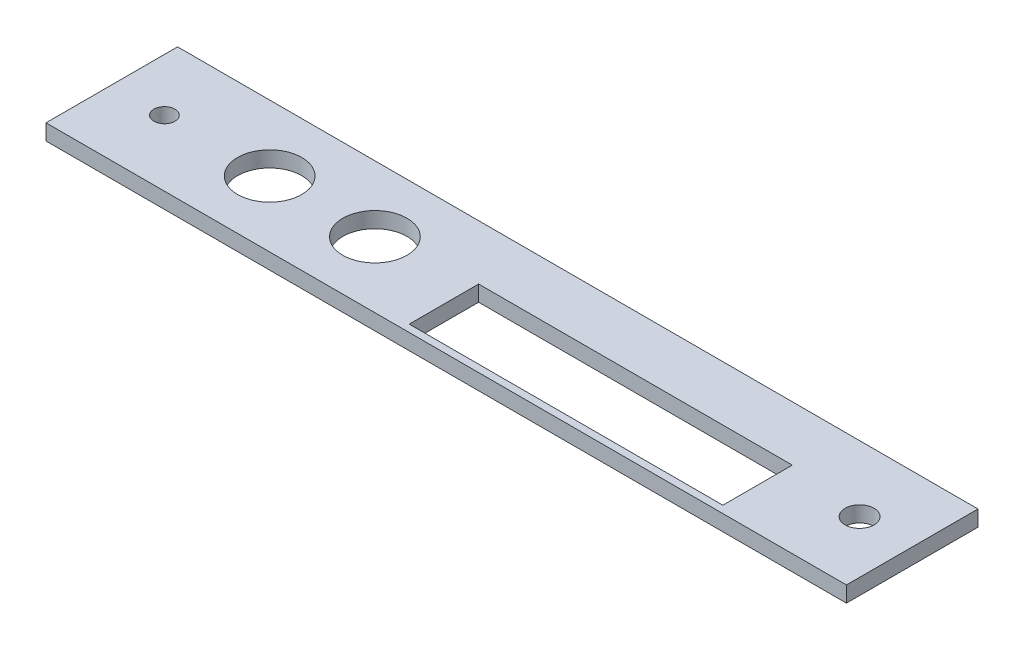
ISO-10303-21;
HEADER;
FILE_DESCRIPTION(('STEP AP214'),'2;1');
FILE_NAME('part.step','',(''),(''),'','','');
FILE_SCHEMA(('AUTOMOTIVE_DESIGN { 1 0 10303 214 1 1 1 1 }'));
ENDSEC;
DATA;
#1=APPLICATION_CONTEXT('core data for automotive mechanical design processes');
#2=APPLICATION_PROTOCOL_DEFINITION('international standard','automotive_design',2000,#1);
#3=PRODUCT_CONTEXT('',#1,'mechanical');
#4=PRODUCT('Part','Part','',(#3));
#5=PRODUCT_RELATED_PRODUCT_CATEGORY('part','',(#4));
#6=PRODUCT_DEFINITION_FORMATION('','',#4);
#7=PRODUCT_DEFINITION_CONTEXT('part definition',#1,'design');
#8=PRODUCT_DEFINITION('design','',#6,#7);
#9=PRODUCT_DEFINITION_SHAPE('','',#8);
#10=(LENGTH_UNIT() NAMED_UNIT(*) SI_UNIT(.MILLI.,.METRE.));
#11=(NAMED_UNIT(*) PLANE_ANGLE_UNIT() SI_UNIT($,.RADIAN.));
#12=(NAMED_UNIT(*) SI_UNIT($,.STERADIAN.) SOLID_ANGLE_UNIT());
#13=UNCERTAINTY_MEASURE_WITH_UNIT(LENGTH_MEASURE(1.E-05),#10,'distance_accuracy_value','');
#14=(GEOMETRIC_REPRESENTATION_CONTEXT(3) GLOBAL_UNCERTAINTY_ASSIGNED_CONTEXT((#13)) GLOBAL_UNIT_ASSIGNED_CONTEXT((#10,
#11,#12)) REPRESENTATION_CONTEXT('',''));
#15=CARTESIAN_POINT('',(0.,0.,0.));
#16=DIRECTION('',(0.,0.,1.));
#17=DIRECTION('',(1.,0.,0.));
#18=AXIS2_PLACEMENT_3D('',#15,#16,#17);
#19=CARTESIAN_POINT('',(0.,3.,0.));
#20=DIRECTION('',(0.,1.,0.));
#21=DIRECTION('',(0.,0.,1.));
#22=AXIS2_PLACEMENT_3D('',#19,#20,#21);
#23=PLANE('',#22);
#24=CARTESIAN_POINT('',(-26.5452804255806,3.,2.07298001122018));
#25=DIRECTION('',(0.,1.,0.));
#26=DIRECTION('',(0.,0.,1.));
#27=AXIS2_PLACEMENT_3D('',#24,#25,#26);
#28=CIRCLE('',#27,6.10000000000001);
#29=CARTESIAN_POINT('',(-26.5452804255806,3.,8.17298001122019));
#30=VERTEX_POINT('',#29);
#31=EDGE_CURVE('E261',#30,#30,#28,.T.);
#32=ORIENTED_EDGE('',*,*,#31,.F.);
#33=EDGE_LOOP('',(#32));
#34=FACE_BOUND('',#33,.T.);
#35=CARTESIAN_POINT('',(65.5547195744145,3.,2.07298001122016));
#36=DIRECTION('',(0.,1.,0.));
#37=DIRECTION('',(0.,0.,1.));
#38=AXIS2_PLACEMENT_3D('',#35,#36,#37);
#39=CIRCLE('',#38,2.75000000000001);
#40=CARTESIAN_POINT('',(65.5547195744145,3.,4.82298001122017));
#41=VERTEX_POINT('',#40);
#42=EDGE_CURVE('E145',#41,#41,#39,.T.);
#43=ORIENTED_EDGE('',*,*,#42,.F.);
#44=EDGE_LOOP('',(#43));
#45=FACE_BOUND('',#44,.T.);
#46=DIRECTION('',(0.,0.,-1.));
#47=VECTOR('',#46,1.);
#48=CARTESIAN_POINT('',(75.5547195744145,3.,-10.4270199887799));
#49=LINE('',#48,#47);
#50=CARTESIAN_POINT('',(75.5547195744145,3.,14.5729800112202));
#51=VERTEX_POINT('',#50);
#52=CARTESIAN_POINT('',(75.5547195744145,3.,-10.4270199887799));
#53=VERTEX_POINT('',#52);
#54=EDGE_CURVE('E151',#51,#53,#49,.T.);
#55=ORIENTED_EDGE('',*,*,#54,.T.);
#56=DIRECTION('',(-1.,0.,0.));
#57=VECTOR('',#56,1.);
#58=CARTESIAN_POINT('',(-76.5452804255805,3.,-10.4270199887798));
#59=LINE('',#58,#57);
#60=CARTESIAN_POINT('',(-76.5452804255805,3.,-10.4270199887798));
#61=VERTEX_POINT('',#60);
#62=EDGE_CURVE('E154',#53,#61,#59,.T.);
#63=ORIENTED_EDGE('',*,*,#62,.T.);
#64=DIRECTION('',(0.,0.,1.));
#65=VECTOR('',#64,1.);
#66=CARTESIAN_POINT('',(-76.5452804255805,3.,-10.4270199887798));
#67=LINE('',#66,#65);
#68=CARTESIAN_POINT('',(-76.5452804255805,3.,14.5729800112202));
#69=VERTEX_POINT('',#68);
#70=EDGE_CURVE('E157',#61,#69,#67,.T.);
#71=ORIENTED_EDGE('',*,*,#70,.T.);
#72=DIRECTION('',(1.,0.,0.));
#73=VECTOR('',#72,1.);
#74=CARTESIAN_POINT('',(-76.5452804255805,3.,14.5729800112202));
#75=LINE('',#74,#73);
#76=EDGE_CURVE('E159',#69,#51,#75,.T.);
#77=ORIENTED_EDGE('',*,*,#76,.T.);
#78=EDGE_LOOP('',(#55,#63,#71,#77));
#79=FACE_BOUND('',#78,.T.);
#80=CARTESIAN_POINT('',(-66.5452804255806,3.,2.07298001122018));
#81=DIRECTION('',(0.,1.,0.));
#82=DIRECTION('',(0.,0.,1.));
#83=AXIS2_PLACEMENT_3D('',#80,#81,#82);
#84=CIRCLE('',#83,2.00000000000001);
#85=CARTESIAN_POINT('',(-66.5452804255806,3.,4.07298001122019));
#86=VERTEX_POINT('',#85);
#87=EDGE_CURVE('E137',#86,#86,#84,.T.);
#88=ORIENTED_EDGE('',*,*,#87,.F.);
#89=EDGE_LOOP('',(#88));
#90=FACE_BOUND('',#89,.T.);
#91=DIRECTION('',(1.,0.,0.));
#92=VECTOR('',#91,1.);
#93=CARTESIAN_POINT('',(-8.9080708952267,3.,13.1899771424671));
#94=LINE('',#93,#92);
#95=CARTESIAN_POINT('',(-8.9080708952267,3.,13.1899771424671));
#96=VERTEX_POINT('',#95);
#97=CARTESIAN_POINT('',(50.6905385695256,3.,13.1899771424671));
#98=VERTEX_POINT('',#97);
#99=EDGE_CURVE('E107',#96,#98,#94,.T.);
#100=ORIENTED_EDGE('',*,*,#99,.F.);
#101=DIRECTION('',(0.,0.,1.));
#102=VECTOR('',#101,1.);
#103=CARTESIAN_POINT('',(-8.9080708952267,3.,0.));
#104=LINE('',#103,#102);
#105=CARTESIAN_POINT('',(-8.9080708952267,3.,0.));
#106=VERTEX_POINT('',#105);
#107=EDGE_CURVE('E99',#106,#96,#104,.T.);
#108=ORIENTED_EDGE('',*,*,#107,.F.);
#109=DIRECTION('',(-1.,0.,0.));
#110=VECTOR('',#109,1.);
#111=CARTESIAN_POINT('',(-8.9080708952267,3.,0.));
#112=LINE('',#111,#110);
#113=CARTESIAN_POINT('',(50.6905385695256,3.,0.));
#114=VERTEX_POINT('',#113);
#115=EDGE_CURVE('E122',#114,#106,#112,.T.);
#116=ORIENTED_EDGE('',*,*,#115,.F.);
#117=DIRECTION('',(0.,0.,-1.));
#118=VECTOR('',#117,1.);
#119=CARTESIAN_POINT('',(50.6905385695256,3.,0.));
#120=LINE('',#119,#118);
#121=EDGE_CURVE('E120',#98,#114,#120,.T.);
#122=ORIENTED_EDGE('',*,*,#121,.F.);
#123=EDGE_LOOP('',(#100,#108,#116,#122));
#124=FACE_BOUND('',#123,.T.);
#125=CARTESIAN_POINT('',(-46.5452804255806,3.,2.07298001122018));
#126=DIRECTION('',(0.,1.,0.));
#127=DIRECTION('',(0.,0.,1.));
#128=AXIS2_PLACEMENT_3D('',#125,#126,#127);
#129=CIRCLE('',#128,6.1);
#130=CARTESIAN_POINT('',(-46.5452804255806,3.,8.17298001122018));
#131=VERTEX_POINT('',#130);
#132=EDGE_CURVE('E144',#131,#131,#129,.T.);
#133=ORIENTED_EDGE('',*,*,#132,.F.);
#134=EDGE_LOOP('',(#133));
#135=FACE_BOUND('',#134,.T.);
#136=ADVANCED_FACE('F34',(#34,#45,#79,#90,#124,#135),#23,.T.);
#137=CARTESIAN_POINT('',(0.,0.,0.));
#138=DIRECTION('',(0.,1.,0.));
#139=DIRECTION('',(0.,0.,1.));
#140=AXIS2_PLACEMENT_3D('',#137,#138,#139);
#141=PLANE('',#140);
#142=CARTESIAN_POINT('',(-66.5452804255806,0.,2.07298001122018));
#143=DIRECTION('',(0.,1.,0.));
#144=DIRECTION('',(0.,0.,1.));
#145=AXIS2_PLACEMENT_3D('',#142,#143,#144);
#146=CIRCLE('',#145,2.00000000000001);
#147=CARTESIAN_POINT('',(-66.5452804255806,0.,4.07298001122019));
#148=VERTEX_POINT('',#147);
#149=EDGE_CURVE('E141',#148,#148,#146,.T.);
#150=ORIENTED_EDGE('',*,*,#149,.T.);
#151=EDGE_LOOP('',(#150));
#152=FACE_BOUND('',#151,.T.);
#153=CARTESIAN_POINT('',(65.5547195744145,0.,2.07298001122016));
#154=DIRECTION('',(0.,1.,0.));
#155=DIRECTION('',(0.,0.,1.));
#156=AXIS2_PLACEMENT_3D('',#153,#154,#155);
#157=CIRCLE('',#156,2.75000000000001);
#158=CARTESIAN_POINT('',(65.5547195744145,0.,4.82298001122017));
#159=VERTEX_POINT('',#158);
#160=EDGE_CURVE('E140',#159,#159,#157,.T.);
#161=ORIENTED_EDGE('',*,*,#160,.T.);
#162=EDGE_LOOP('',(#161));
#163=FACE_BOUND('',#162,.T.);
#164=DIRECTION('',(0.,0.,-1.));
#165=VECTOR('',#164,1.);
#166=CARTESIAN_POINT('',(75.5547195744145,0.,-10.4270199887799));
#167=LINE('',#166,#165);
#168=CARTESIAN_POINT('',(75.5547195744145,0.,14.5729800112202));
#169=VERTEX_POINT('',#168);
#170=CARTESIAN_POINT('',(75.5547195744145,0.,-10.4270199887799));
#171=VERTEX_POINT('',#170);
#172=EDGE_CURVE('E148',#169,#171,#167,.T.);
#173=ORIENTED_EDGE('',*,*,#172,.F.);
#174=DIRECTION('',(1.,0.,0.));
#175=VECTOR('',#174,1.);
#176=CARTESIAN_POINT('',(-76.5452804255805,0.,14.5729800112202));
#177=LINE('',#176,#175);
#178=CARTESIAN_POINT('',(-76.5452804255805,0.,14.5729800112202));
#179=VERTEX_POINT('',#178);
#180=EDGE_CURVE('E155',#179,#169,#177,.T.);
#181=ORIENTED_EDGE('',*,*,#180,.F.);
#182=DIRECTION('',(0.,0.,1.));
#183=VECTOR('',#182,1.);
#184=CARTESIAN_POINT('',(-76.5452804255805,0.,-10.4270199887798));
#185=LINE('',#184,#183);
#186=CARTESIAN_POINT('',(-76.5452804255805,0.,-10.4270199887798));
#187=VERTEX_POINT('',#186);
#188=EDGE_CURVE('E166',#187,#179,#185,.T.);
#189=ORIENTED_EDGE('',*,*,#188,.F.);
#190=DIRECTION('',(-1.,0.,0.));
#191=VECTOR('',#190,1.);
#192=CARTESIAN_POINT('',(-76.5452804255805,0.,-10.4270199887798));
#193=LINE('',#192,#191);
#194=EDGE_CURVE('E164',#171,#187,#193,.T.);
#195=ORIENTED_EDGE('',*,*,#194,.F.);
#196=EDGE_LOOP('',(#173,#181,#189,#195));
#197=FACE_BOUND('',#196,.T.);
#198=DIRECTION('',(0.,0.,1.));
#199=VECTOR('',#198,1.);
#200=CARTESIAN_POINT('',(-8.9080708952267,0.,0.));
#201=LINE('',#200,#199);
#202=CARTESIAN_POINT('',(-8.9080708952267,0.,0.));
#203=VERTEX_POINT('',#202);
#204=CARTESIAN_POINT('',(-8.9080708952267,0.,13.1899771424671));
#205=VERTEX_POINT('',#204);
#206=EDGE_CURVE('E57',#203,#205,#201,.T.);
#207=ORIENTED_EDGE('',*,*,#206,.T.);
#208=DIRECTION('',(1.,0.,0.));
#209=VECTOR('',#208,1.);
#210=CARTESIAN_POINT('',(-8.9080708952267,0.,13.1899771424671));
#211=LINE('',#210,#209);
#212=CARTESIAN_POINT('',(50.6905385695256,0.,13.1899771424671));
#213=VERTEX_POINT('',#212);
#214=EDGE_CURVE('E114',#205,#213,#211,.T.);
#215=ORIENTED_EDGE('',*,*,#214,.T.);
#216=DIRECTION('',(0.,0.,-1.));
#217=VECTOR('',#216,1.);
#218=CARTESIAN_POINT('',(50.6905385695256,0.,0.));
#219=LINE('',#218,#217);
#220=CARTESIAN_POINT('',(50.6905385695256,0.,0.));
#221=VERTEX_POINT('',#220);
#222=EDGE_CURVE('E129',#213,#221,#219,.T.);
#223=ORIENTED_EDGE('',*,*,#222,.T.);
#224=DIRECTION('',(-1.,0.,0.));
#225=VECTOR('',#224,1.);
#226=CARTESIAN_POINT('',(-8.9080708952267,0.,0.));
#227=LINE('',#226,#225);
#228=EDGE_CURVE('E108',#221,#203,#227,.T.);
#229=ORIENTED_EDGE('',*,*,#228,.T.);
#230=EDGE_LOOP('',(#207,#215,#223,#229));
#231=FACE_BOUND('',#230,.T.);
#232=CARTESIAN_POINT('',(-26.5452804255806,0.,2.07298001122018));
#233=DIRECTION('',(0.,1.,0.));
#234=DIRECTION('',(0.,0.,1.));
#235=AXIS2_PLACEMENT_3D('',#232,#233,#234);
#236=CIRCLE('',#235,6.10000000000001);
#237=CARTESIAN_POINT('',(-26.5452804255806,0.,8.17298001122019));
#238=VERTEX_POINT('',#237);
#239=EDGE_CURVE('E115',#238,#238,#236,.T.);
#240=ORIENTED_EDGE('',*,*,#239,.T.);
#241=EDGE_LOOP('',(#240));
#242=FACE_BOUND('',#241,.T.);
#243=CARTESIAN_POINT('',(-46.5452804255806,0.,2.07298001122018));
#244=DIRECTION('',(0.,1.,0.));
#245=DIRECTION('',(0.,0.,1.));
#246=AXIS2_PLACEMENT_3D('',#243,#244,#245);
#247=CIRCLE('',#246,6.1);
#248=CARTESIAN_POINT('',(-46.5452804255806,0.,8.17298001122018));
#249=VERTEX_POINT('',#248);
#250=EDGE_CURVE('E259',#249,#249,#247,.T.);
#251=ORIENTED_EDGE('',*,*,#250,.T.);
#252=EDGE_LOOP('',(#251));
#253=FACE_BOUND('',#252,.T.);
#254=ADVANCED_FACE('F184',(#152,#163,#197,#231,#242,#253),#141,.F.);
#255=CARTESIAN_POINT('',(75.5547195744145,3.,-10.4270199887799));
#256=DIRECTION('',(-1.,0.,0.));
#257=DIRECTION('',(0.,0.,1.));
#258=AXIS2_PLACEMENT_3D('',#255,#256,#257);
#259=PLANE('',#258);
#260=ORIENTED_EDGE('',*,*,#172,.T.);
#261=DIRECTION('',(0.,-1.,0.));
#262=VECTOR('',#261,1.);
#263=CARTESIAN_POINT('',(75.5547195744145,3.,-10.4270199887799));
#264=LINE('',#263,#262);
#265=EDGE_CURVE('E11',#53,#171,#264,.T.);
#266=ORIENTED_EDGE('',*,*,#265,.F.);
#267=ORIENTED_EDGE('',*,*,#54,.F.);
#268=DIRECTION('',(0.,-1.,0.));
#269=VECTOR('',#268,1.);
#270=CARTESIAN_POINT('',(75.5547195744145,3.,14.5729800112202));
#271=LINE('',#270,#269);
#272=EDGE_CURVE('E161',#51,#169,#271,.T.);
#273=ORIENTED_EDGE('',*,*,#272,.T.);
#274=EDGE_LOOP('',(#260,#266,#267,#273));
#275=FACE_BOUND('',#274,.T.);
#276=ADVANCED_FACE('F36',(#275),#259,.F.);
#277=CARTESIAN_POINT('',(-76.5452804255805,3.,-10.4270199887798));
#278=DIRECTION('',(0.,0.,1.));
#279=DIRECTION('',(1.,0.,0.));
#280=AXIS2_PLACEMENT_3D('',#277,#278,#279);
#281=PLANE('',#280);
#282=ORIENTED_EDGE('',*,*,#194,.T.);
#283=DIRECTION('',(0.,-1.,0.));
#284=VECTOR('',#283,1.);
#285=CARTESIAN_POINT('',(-76.5452804255805,3.,-10.4270199887798));
#286=LINE('',#285,#284);
#287=EDGE_CURVE('E42',#61,#187,#286,.T.);
#288=ORIENTED_EDGE('',*,*,#287,.F.);
#289=ORIENTED_EDGE('',*,*,#62,.F.);
#290=ORIENTED_EDGE('',*,*,#265,.T.);
#291=EDGE_LOOP('',(#282,#288,#289,#290));
#292=FACE_BOUND('',#291,.T.);
#293=ADVANCED_FACE('F195',(#292),#281,.F.);
#294=CARTESIAN_POINT('',(-76.5452804255805,3.,-10.4270199887798));
#295=DIRECTION('',(1.,0.,0.));
#296=DIRECTION('',(0.,0.,-1.));
#297=AXIS2_PLACEMENT_3D('',#294,#295,#296);
#298=PLANE('',#297);
#299=ORIENTED_EDGE('',*,*,#188,.T.);
#300=DIRECTION('',(0.,-1.,0.));
#301=VECTOR('',#300,1.);
#302=CARTESIAN_POINT('',(-76.5452804255805,3.,14.5729800112202));
#303=LINE('',#302,#301);
#304=EDGE_CURVE('E171',#69,#179,#303,.T.);
#305=ORIENTED_EDGE('',*,*,#304,.F.);
#306=ORIENTED_EDGE('',*,*,#70,.F.);
#307=ORIENTED_EDGE('',*,*,#287,.T.);
#308=EDGE_LOOP('',(#299,#305,#306,#307));
#309=FACE_BOUND('',#308,.T.);
#310=ADVANCED_FACE('F178',(#309),#298,.F.);
#311=CARTESIAN_POINT('',(-76.5452804255805,3.,14.5729800112202));
#312=DIRECTION('',(0.,0.,-1.));
#313=DIRECTION('',(-1.,0.,0.));
#314=AXIS2_PLACEMENT_3D('',#311,#312,#313);
#315=PLANE('',#314);
#316=ORIENTED_EDGE('',*,*,#180,.T.);
#317=ORIENTED_EDGE('',*,*,#272,.F.);
#318=ORIENTED_EDGE('',*,*,#76,.F.);
#319=ORIENTED_EDGE('',*,*,#304,.T.);
#320=EDGE_LOOP('',(#316,#317,#318,#319));
#321=FACE_BOUND('',#320,.T.);
#322=ADVANCED_FACE('F188',(#321),#315,.F.);
#323=CARTESIAN_POINT('',(65.5547195744145,3.,2.07298001122016));
#324=DIRECTION('',(0.,-1.,0.));
#325=DIRECTION('',(0.,0.,-1.));
#326=AXIS2_PLACEMENT_3D('',#323,#324,#325);
#327=CYLINDRICAL_SURFACE('',#326,2.75000000000001);
#328=ORIENTED_EDGE('',*,*,#42,.T.);
#329=EDGE_LOOP('',(#328));
#330=FACE_BOUND('',#329,.T.);
#331=ORIENTED_EDGE('',*,*,#160,.F.);
#332=EDGE_LOOP('',(#331));
#333=FACE_BOUND('',#332,.T.);
#334=ADVANCED_FACE('F213',(#330,#333),#327,.F.);
#335=CARTESIAN_POINT('',(-66.5452804255806,3.,2.07298001122018));
#336=DIRECTION('',(0.,-1.,0.));
#337=DIRECTION('',(0.,0.,-1.));
#338=AXIS2_PLACEMENT_3D('',#335,#336,#337);
#339=CYLINDRICAL_SURFACE('',#338,2.00000000000001);
#340=ORIENTED_EDGE('',*,*,#87,.T.);
#341=EDGE_LOOP('',(#340));
#342=FACE_BOUND('',#341,.T.);
#343=ORIENTED_EDGE('',*,*,#149,.F.);
#344=EDGE_LOOP('',(#343));
#345=FACE_BOUND('',#344,.T.);
#346=ADVANCED_FACE('F220',(#342,#345),#339,.F.);
#347=CARTESIAN_POINT('',(-8.9080708952267,3.,0.));
#348=DIRECTION('',(1.,0.,0.));
#349=DIRECTION('',(0.,0.,-1.));
#350=AXIS2_PLACEMENT_3D('',#347,#348,#349);
#351=PLANE('',#350);
#352=ORIENTED_EDGE('',*,*,#206,.F.);
#353=DIRECTION('',(0.,-1.,0.));
#354=VECTOR('',#353,1.);
#355=CARTESIAN_POINT('',(-8.9080708952267,3.,0.));
#356=LINE('',#355,#354);
#357=EDGE_CURVE('E103',#106,#203,#356,.T.);
#358=ORIENTED_EDGE('',*,*,#357,.F.);
#359=ORIENTED_EDGE('',*,*,#107,.T.);
#360=DIRECTION('',(0.,-1.,0.));
#361=VECTOR('',#360,1.);
#362=CARTESIAN_POINT('',(-8.9080708952267,3.,13.1899771424671));
#363=LINE('',#362,#361);
#364=EDGE_CURVE('E102',#96,#205,#363,.T.);
#365=ORIENTED_EDGE('',*,*,#364,.T.);
#366=EDGE_LOOP('',(#352,#358,#359,#365));
#367=FACE_BOUND('',#366,.T.);
#368=ADVANCED_FACE('F101',(#367),#351,.T.);
#369=CARTESIAN_POINT('',(-8.9080708952267,3.,13.1899771424671));
#370=DIRECTION('',(0.,0.,-1.));
#371=DIRECTION('',(-1.,0.,0.));
#372=AXIS2_PLACEMENT_3D('',#369,#370,#371);
#373=PLANE('',#372);
#374=ORIENTED_EDGE('',*,*,#214,.F.);
#375=ORIENTED_EDGE('',*,*,#364,.F.);
#376=ORIENTED_EDGE('',*,*,#99,.T.);
#377=DIRECTION('',(0.,-1.,0.));
#378=VECTOR('',#377,1.);
#379=CARTESIAN_POINT('',(50.6905385695256,3.,13.1899771424671));
#380=LINE('',#379,#378);
#381=EDGE_CURVE('E116',#98,#213,#380,.T.);
#382=ORIENTED_EDGE('',*,*,#381,.T.);
#383=EDGE_LOOP('',(#374,#375,#376,#382));
#384=FACE_BOUND('',#383,.T.);
#385=ADVANCED_FACE('F111',(#384),#373,.T.);
#386=CARTESIAN_POINT('',(50.6905385695256,3.,0.));
#387=DIRECTION('',(-1.,0.,0.));
#388=DIRECTION('',(0.,0.,1.));
#389=AXIS2_PLACEMENT_3D('',#386,#387,#388);
#390=PLANE('',#389);
#391=ORIENTED_EDGE('',*,*,#222,.F.);
#392=ORIENTED_EDGE('',*,*,#381,.F.);
#393=ORIENTED_EDGE('',*,*,#121,.T.);
#394=DIRECTION('',(0.,-1.,0.));
#395=VECTOR('',#394,1.);
#396=CARTESIAN_POINT('',(50.6905385695256,3.,0.));
#397=LINE('',#396,#395);
#398=EDGE_CURVE('E49',#114,#221,#397,.T.);
#399=ORIENTED_EDGE('',*,*,#398,.T.);
#400=EDGE_LOOP('',(#391,#392,#393,#399));
#401=FACE_BOUND('',#400,.T.);
#402=ADVANCED_FACE('F238',(#401),#390,.T.);
#403=CARTESIAN_POINT('',(-8.9080708952267,3.,0.));
#404=DIRECTION('',(0.,0.,1.));
#405=DIRECTION('',(1.,0.,0.));
#406=AXIS2_PLACEMENT_3D('',#403,#404,#405);
#407=PLANE('',#406);
#408=ORIENTED_EDGE('',*,*,#228,.F.);
#409=ORIENTED_EDGE('',*,*,#398,.F.);
#410=ORIENTED_EDGE('',*,*,#115,.T.);
#411=ORIENTED_EDGE('',*,*,#357,.T.);
#412=EDGE_LOOP('',(#408,#409,#410,#411));
#413=FACE_BOUND('',#412,.T.);
#414=ADVANCED_FACE('F241',(#413),#407,.T.);
#415=CARTESIAN_POINT('',(-26.5452804255806,3.,2.07298001122018));
#416=DIRECTION('',(0.,-1.,0.));
#417=DIRECTION('',(0.,0.,-1.));
#418=AXIS2_PLACEMENT_3D('',#415,#416,#417);
#419=CYLINDRICAL_SURFACE('',#418,6.10000000000001);
#420=ORIENTED_EDGE('',*,*,#31,.T.);
#421=EDGE_LOOP('',(#420));
#422=FACE_BOUND('',#421,.T.);
#423=ORIENTED_EDGE('',*,*,#239,.F.);
#424=EDGE_LOOP('',(#423));
#425=FACE_BOUND('',#424,.T.);
#426=ADVANCED_FACE('F245',(#422,#425),#419,.F.);
#427=CARTESIAN_POINT('',(-46.5452804255806,3.,2.07298001122018));
#428=DIRECTION('',(0.,-1.,0.));
#429=DIRECTION('',(0.,0.,-1.));
#430=AXIS2_PLACEMENT_3D('',#427,#428,#429);
#431=CYLINDRICAL_SURFACE('',#430,6.1);
#432=ORIENTED_EDGE('',*,*,#132,.T.);
#433=EDGE_LOOP('',(#432));
#434=FACE_BOUND('',#433,.T.);
#435=ORIENTED_EDGE('',*,*,#250,.F.);
#436=EDGE_LOOP('',(#435));
#437=FACE_BOUND('',#436,.T.);
#438=ADVANCED_FACE('F248',(#434,#437),#431,.F.);
#439=CLOSED_SHELL('',(#136,#254,#276,#293,#310,#322,#334,#346,#368,#385,#402,#414,#426,#438));
#440=MANIFOLD_SOLID_BREP('B2',#439);
#441=ADVANCED_BREP_SHAPE_REPRESENTATION('',(#18,#440),#14);
#442=SHAPE_DEFINITION_REPRESENTATION(#9,#441);
ENDSEC;
END-ISO-10303-21;
